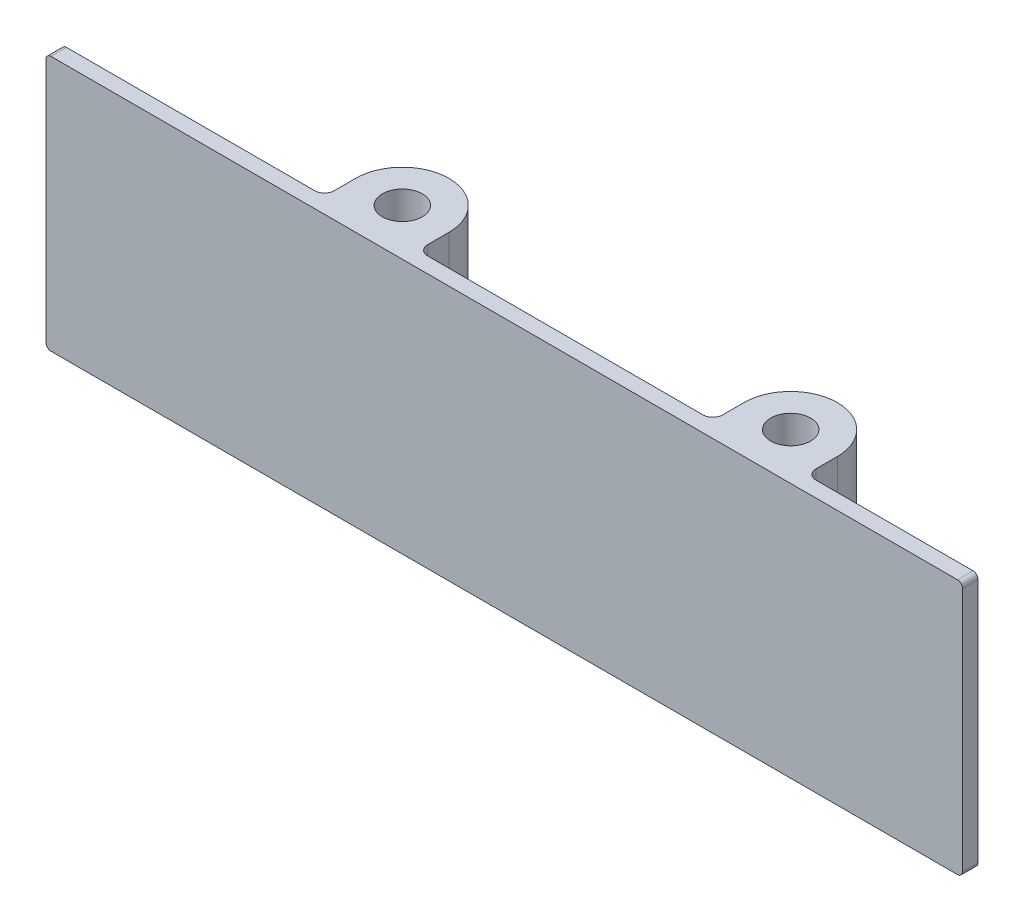
ISO-10303-21;
HEADER;
FILE_DESCRIPTION(('STEP AP214'),'2;1');
FILE_NAME('part.step','',(''),(''),'','','');
FILE_SCHEMA(('AUTOMOTIVE_DESIGN { 1 0 10303 214 1 1 1 1 }'));
ENDSEC;
DATA;
#1=APPLICATION_CONTEXT('core data for automotive mechanical design processes');
#2=APPLICATION_PROTOCOL_DEFINITION('international standard','automotive_design',2000,#1);
#3=PRODUCT_CONTEXT('',#1,'mechanical');
#4=PRODUCT('Part','Part','',(#3));
#5=PRODUCT_RELATED_PRODUCT_CATEGORY('part','',(#4));
#6=PRODUCT_DEFINITION_FORMATION('','',#4);
#7=PRODUCT_DEFINITION_CONTEXT('part definition',#1,'design');
#8=PRODUCT_DEFINITION('design','',#6,#7);
#9=PRODUCT_DEFINITION_SHAPE('','',#8);
#10=(LENGTH_UNIT() NAMED_UNIT(*) SI_UNIT(.MILLI.,.METRE.));
#11=(NAMED_UNIT(*) PLANE_ANGLE_UNIT() SI_UNIT($,.RADIAN.));
#12=(NAMED_UNIT(*) SI_UNIT($,.STERADIAN.) SOLID_ANGLE_UNIT());
#13=UNCERTAINTY_MEASURE_WITH_UNIT(LENGTH_MEASURE(1.E-05),#10,'distance_accuracy_value','');
#14=(GEOMETRIC_REPRESENTATION_CONTEXT(3) GLOBAL_UNCERTAINTY_ASSIGNED_CONTEXT((#13)) GLOBAL_UNIT_ASSIGNED_CONTEXT((#10,
#11,#12)) REPRESENTATION_CONTEXT('',''));
#15=CARTESIAN_POINT('',(0.,0.,0.));
#16=DIRECTION('',(0.,0.,1.));
#17=DIRECTION('',(1.,0.,0.));
#18=AXIS2_PLACEMENT_3D('',#15,#16,#17);
#19=CARTESIAN_POINT('',(0.,0.,0.));
#20=DIRECTION('',(0.,0.,-1.));
#21=DIRECTION('',(-1.,0.,0.));
#22=AXIS2_PLACEMENT_3D('',#19,#20,#21);
#23=PLANE('',#22);
#24=DIRECTION('',(0.,1.,0.));
#25=VECTOR('',#24,1.);
#26=CARTESIAN_POINT('',(187.00242,0.,0.));
#27=LINE('',#26,#25);
#28=CARTESIAN_POINT('',(187.00242,1.,0.));
#29=VERTEX_POINT('',#28);
#30=CARTESIAN_POINT('',(187.00242,51.10048,0.));
#31=VERTEX_POINT('',#30);
#32=EDGE_CURVE('E262',#29,#31,#27,.T.);
#33=ORIENTED_EDGE('',*,*,#32,.F.);
#34=CARTESIAN_POINT('',(186.00242,1.,0.));
#35=DIRECTION('',(0.,0.,-1.));
#36=DIRECTION('',(-1.,0.,0.));
#37=AXIS2_PLACEMENT_3D('',#34,#35,#36);
#38=CIRCLE('',#37,1.);
#39=CARTESIAN_POINT('',(186.00242,0.,0.));
#40=VERTEX_POINT('',#39);
#41=EDGE_CURVE('E310',#29,#40,#38,.T.);
#42=ORIENTED_EDGE('',*,*,#41,.T.);
#43=DIRECTION('',(1.,0.,0.));
#44=VECTOR('',#43,1.);
#45=CARTESIAN_POINT('',(0.,0.,0.));
#46=LINE('',#45,#44);
#47=CARTESIAN_POINT('',(153.95541999,0.,0.));
#48=VERTEX_POINT('',#47);
#49=EDGE_CURVE('E259',#48,#40,#46,.T.);
#50=ORIENTED_EDGE('',*,*,#49,.F.);
#51=DIRECTION('',(0.,1.,0.));
#52=VECTOR('',#51,1.);
#53=CARTESIAN_POINT('',(153.95541999,52.10048,0.));
#54=LINE('',#53,#52);
#55=CARTESIAN_POINT('',(153.95541999,52.10048,0.));
#56=VERTEX_POINT('',#55);
#57=EDGE_CURVE('E281',#48,#56,#54,.T.);
#58=ORIENTED_EDGE('',*,*,#57,.T.);
#59=DIRECTION('',(-1.,0.,0.));
#60=VECTOR('',#59,1.);
#61=CARTESIAN_POINT('',(0.,52.10048,0.));
#62=LINE('',#61,#60);
#63=CARTESIAN_POINT('',(186.00242,52.10048,0.));
#64=VERTEX_POINT('',#63);
#65=EDGE_CURVE('E248',#64,#56,#62,.T.);
#66=ORIENTED_EDGE('',*,*,#65,.F.);
#67=CARTESIAN_POINT('',(186.00242,51.10048,0.));
#68=DIRECTION('',(0.,0.,-1.));
#69=DIRECTION('',(-1.,0.,0.));
#70=AXIS2_PLACEMENT_3D('',#67,#68,#69);
#71=CIRCLE('',#70,1.);
#72=EDGE_CURVE('E308',#64,#31,#71,.T.);
#73=ORIENTED_EDGE('',*,*,#72,.T.);
#74=EDGE_LOOP('',(#33,#42,#50,#58,#66,#73));
#75=FACE_BOUND('',#74,.T.);
#76=ADVANCED_FACE('F36',(#75),#23,.T.);
#77=CARTESIAN_POINT('',(130.89542001,52.10048,0.));
#78=VERTEX_POINT('',#77);
#79=CARTESIAN_POINT('',(74.70741999,52.10048,0.));
#80=VERTEX_POINT('',#79);
#81=EDGE_CURVE('E268',#78,#80,#62,.T.);
#82=ORIENTED_EDGE('',*,*,#81,.F.);
#83=DIRECTION('',(0.,1.,0.));
#84=VECTOR('',#83,1.);
#85=CARTESIAN_POINT('',(130.89542001,0.,0.));
#86=LINE('',#85,#84);
#87=CARTESIAN_POINT('',(130.89542001,0.,0.));
#88=VERTEX_POINT('',#87);
#89=EDGE_CURVE('E279',#78,#88,#86,.F.);
#90=ORIENTED_EDGE('',*,*,#89,.T.);
#91=CARTESIAN_POINT('',(74.70741999,0.,0.));
#92=VERTEX_POINT('',#91);
#93=EDGE_CURVE('E263',#92,#88,#46,.T.);
#94=ORIENTED_EDGE('',*,*,#93,.F.);
#95=DIRECTION('',(0.,1.,0.));
#96=VECTOR('',#95,1.);
#97=CARTESIAN_POINT('',(74.70741999,52.10048,0.));
#98=LINE('',#97,#96);
#99=EDGE_CURVE('E276',#92,#80,#98,.T.);
#100=ORIENTED_EDGE('',*,*,#99,.T.);
#101=EDGE_LOOP('',(#82,#90,#94,#100));
#102=FACE_BOUND('',#101,.T.);
#103=ADVANCED_FACE('F396',(#102),#23,.T.);
#104=CARTESIAN_POINT('',(0.,0.,3.175));
#105=DIRECTION('',(1.,0.,0.));
#106=DIRECTION('',(0.,0.,-1.));
#107=AXIS2_PLACEMENT_3D('',#104,#105,#106);
#108=PLANE('',#107);
#109=DIRECTION('',(0.,-1.,0.));
#110=VECTOR('',#109,1.);
#111=CARTESIAN_POINT('',(0.,0.,0.));
#112=LINE('',#111,#110);
#113=CARTESIAN_POINT('',(0.,51.10048,0.));
#114=VERTEX_POINT('',#113);
#115=CARTESIAN_POINT('',(0.,1.,0.));
#116=VERTEX_POINT('',#115);
#117=EDGE_CURVE('E242',#114,#116,#112,.T.);
#118=ORIENTED_EDGE('',*,*,#117,.T.);
#119=DIRECTION('',(0.,0.,-1.));
#120=VECTOR('',#119,1.);
#121=CARTESIAN_POINT('',(0.,1.,3.175));
#122=LINE('',#121,#120);
#123=CARTESIAN_POINT('',(0.,1.,3.175));
#124=VERTEX_POINT('',#123);
#125=EDGE_CURVE('E11',#116,#124,#122,.F.);
#126=ORIENTED_EDGE('',*,*,#125,.T.);
#127=DIRECTION('',(0.,-1.,0.));
#128=VECTOR('',#127,1.);
#129=CARTESIAN_POINT('',(0.,0.,3.175));
#130=LINE('',#129,#128);
#131=CARTESIAN_POINT('',(0.,51.10048,3.175));
#132=VERTEX_POINT('',#131);
#133=EDGE_CURVE('E244',#132,#124,#130,.T.);
#134=ORIENTED_EDGE('',*,*,#133,.F.);
#135=DIRECTION('',(0.,0.,-1.));
#136=VECTOR('',#135,1.);
#137=CARTESIAN_POINT('',(0.,51.10048,3.175));
#138=LINE('',#137,#136);
#139=EDGE_CURVE('E44',#132,#114,#138,.T.);
#140=ORIENTED_EDGE('',*,*,#139,.T.);
#141=EDGE_LOOP('',(#118,#126,#134,#140));
#142=FACE_BOUND('',#141,.T.);
#143=ADVANCED_FACE('F333',(#142),#108,.F.);
#144=CARTESIAN_POINT('',(0.,0.,3.175));
#145=DIRECTION('',(0.,1.,0.));
#146=DIRECTION('',(0.,0.,1.));
#147=AXIS2_PLACEMENT_3D('',#144,#145,#146);
#148=PLANE('',#147);
#149=ORIENTED_EDGE('',*,*,#49,.T.);
#150=DIRECTION('',(0.,0.,-1.));
#151=VECTOR('',#150,1.);
#152=CARTESIAN_POINT('',(186.00242,0.,3.175));
#153=LINE('',#152,#151);
#154=CARTESIAN_POINT('',(186.00242,0.,3.175));
#155=VERTEX_POINT('',#154);
#156=EDGE_CURVE('E315',#40,#155,#153,.F.);
#157=ORIENTED_EDGE('',*,*,#156,.T.);
#158=DIRECTION('',(1.,0.,0.));
#159=VECTOR('',#158,1.);
#160=CARTESIAN_POINT('',(0.,0.,3.175));
#161=LINE('',#160,#159);
#162=CARTESIAN_POINT('',(1.,0.,3.175));
#163=VERTEX_POINT('',#162);
#164=EDGE_CURVE('E247',#163,#155,#161,.T.);
#165=ORIENTED_EDGE('',*,*,#164,.F.);
#166=DIRECTION('',(0.,0.,-1.));
#167=VECTOR('',#166,1.);
#168=CARTESIAN_POINT('',(1.,0.,3.175));
#169=LINE('',#168,#167);
#170=CARTESIAN_POINT('',(1.,0.,0.));
#171=VERTEX_POINT('',#170);
#172=EDGE_CURVE('E312',#163,#171,#169,.T.);
#173=ORIENTED_EDGE('',*,*,#172,.T.);
#174=CARTESIAN_POINT('',(51.64742001,0.,0.));
#175=VERTEX_POINT('',#174);
#176=EDGE_CURVE('E260',#171,#175,#46,.T.);
#177=ORIENTED_EDGE('',*,*,#176,.T.);
#178=CARTESIAN_POINT('',(51.64742001,0.,-2.));
#179=DIRECTION('',(0.,1.,0.));
#180=DIRECTION('',(0.,0.,1.));
#181=AXIS2_PLACEMENT_3D('',#178,#179,#180);
#182=CIRCLE('',#181,2.);
#183=CARTESIAN_POINT('',(53.64742001,0.,-2.00000000000001));
#184=VERTEX_POINT('',#183);
#185=EDGE_CURVE('E290',#175,#184,#182,.T.);
#186=ORIENTED_EDGE('',*,*,#185,.T.);
#187=DIRECTION('',(0.,0.,1.));
#188=VECTOR('',#187,1.);
#189=CARTESIAN_POINT('',(53.64742001,0.,-6.35499999));
#190=LINE('',#189,#188);
#191=CARTESIAN_POINT('',(53.64742001,0.,-6.35499999));
#192=VERTEX_POINT('',#191);
#193=EDGE_CURVE('E226',#192,#184,#190,.T.);
#194=ORIENTED_EDGE('',*,*,#193,.F.);
#195=CARTESIAN_POINT('',(63.17742,0.,-6.35499999));
#196=DIRECTION('',(0.,1.,0.));
#197=DIRECTION('',(0.,0.,1.));
#198=AXIS2_PLACEMENT_3D('',#195,#196,#197);
#199=CIRCLE('',#198,9.52999999);
#200=CARTESIAN_POINT('',(72.70741999,0.,-6.35499999));
#201=VERTEX_POINT('',#200);
#202=EDGE_CURVE('E223',#201,#192,#199,.T.);
#203=ORIENTED_EDGE('',*,*,#202,.F.);
#204=DIRECTION('',(0.,0.,-1.));
#205=VECTOR('',#204,1.);
#206=CARTESIAN_POINT('',(72.70741999,0.,-6.35499999));
#207=LINE('',#206,#205);
#208=CARTESIAN_POINT('',(72.70741999,0.,-2.));
#209=VERTEX_POINT('',#208);
#210=EDGE_CURVE('E230',#209,#201,#207,.T.);
#211=ORIENTED_EDGE('',*,*,#210,.F.);
#212=CARTESIAN_POINT('',(74.70741999,0.,-2.));
#213=DIRECTION('',(0.,1.,0.));
#214=DIRECTION('',(0.,0.,1.));
#215=AXIS2_PLACEMENT_3D('',#212,#213,#214);
#216=CIRCLE('',#215,2.);
#217=EDGE_CURVE('E301',#209,#92,#216,.T.);
#218=ORIENTED_EDGE('',*,*,#217,.T.);
#219=ORIENTED_EDGE('',*,*,#93,.T.);
#220=CARTESIAN_POINT('',(130.89542001,0.,-2.));
#221=DIRECTION('',(0.,1.,0.));
#222=DIRECTION('',(0.,0.,1.));
#223=AXIS2_PLACEMENT_3D('',#220,#221,#222);
#224=CIRCLE('',#223,2.);
#225=CARTESIAN_POINT('',(132.89542001,0.,-2.));
#226=VERTEX_POINT('',#225);
#227=EDGE_CURVE('E198',#88,#226,#224,.T.);
#228=ORIENTED_EDGE('',*,*,#227,.T.);
#229=DIRECTION('',(0.,0.,1.));
#230=VECTOR('',#229,1.);
#231=CARTESIAN_POINT('',(132.89542001,0.,-6.35499999000002));
#232=LINE('',#231,#230);
#233=CARTESIAN_POINT('',(132.89542001,0.,-6.35499999000002));
#234=VERTEX_POINT('',#233);
#235=EDGE_CURVE('E178',#234,#226,#232,.T.);
#236=ORIENTED_EDGE('',*,*,#235,.F.);
#237=CARTESIAN_POINT('',(142.42542,0.,-6.35499999000002));
#238=DIRECTION('',(0.,1.,0.));
#239=DIRECTION('',(0.,0.,1.));
#240=AXIS2_PLACEMENT_3D('',#237,#238,#239);
#241=CIRCLE('',#240,9.52999999000001);
#242=CARTESIAN_POINT('',(151.95541999,0.,-6.35499999000002));
#243=VERTEX_POINT('',#242);
#244=EDGE_CURVE('E195',#243,#234,#241,.T.);
#245=ORIENTED_EDGE('',*,*,#244,.F.);
#246=DIRECTION('',(0.,0.,-1.));
#247=VECTOR('',#246,1.);
#248=CARTESIAN_POINT('',(151.95541999,0.,-6.35499999000002));
#249=LINE('',#248,#247);
#250=CARTESIAN_POINT('',(151.95541999,0.,-2.));
#251=VERTEX_POINT('',#250);
#252=EDGE_CURVE('E187',#251,#243,#249,.T.);
#253=ORIENTED_EDGE('',*,*,#252,.F.);
#254=CARTESIAN_POINT('',(153.95541999,0.,-2.));
#255=DIRECTION('',(0.,1.,0.));
#256=DIRECTION('',(0.,0.,1.));
#257=AXIS2_PLACEMENT_3D('',#254,#255,#256);
#258=CIRCLE('',#257,2.);
#259=EDGE_CURVE('E297',#251,#48,#258,.T.);
#260=ORIENTED_EDGE('',*,*,#259,.T.);
#261=EDGE_LOOP('',(#149,#157,#165,#173,#177,#186,#194,#203,#211,#218,#219,#228,#236,#245,#253,#260));
#262=FACE_BOUND('',#261,.T.);
#263=CARTESIAN_POINT('',(63.17742,0.,-6.35499999));
#264=DIRECTION('',(0.,1.,0.));
#265=DIRECTION('',(0.,0.,1.));
#266=AXIS2_PLACEMENT_3D('',#263,#264,#265);
#267=CIRCLE('',#266,4.07499997799999);
#268=CARTESIAN_POINT('',(63.17742,0.,-2.28000001200001));
#269=VERTEX_POINT('',#268);
#270=EDGE_CURVE('E217',#269,#269,#267,.T.);
#271=ORIENTED_EDGE('',*,*,#270,.T.);
#272=EDGE_LOOP('',(#271));
#273=FACE_BOUND('',#272,.T.);
#274=CARTESIAN_POINT('',(142.42542,0.,-6.35499999000002));
#275=DIRECTION('',(0.,1.,0.));
#276=DIRECTION('',(0.,0.,1.));
#277=AXIS2_PLACEMENT_3D('',#274,#275,#276);
#278=CIRCLE('',#277,4.07499997800001);
#279=CARTESIAN_POINT('',(142.42542,0.,-2.28000001200001));
#280=VERTEX_POINT('',#279);
#281=EDGE_CURVE('E213',#280,#280,#278,.T.);
#282=ORIENTED_EDGE('',*,*,#281,.T.);
#283=EDGE_LOOP('',(#282));
#284=FACE_BOUND('',#283,.T.);
#285=ADVANCED_FACE('F192',(#262,#273,#284),#148,.F.);
#286=CARTESIAN_POINT('',(187.00242,0.,3.175));
#287=DIRECTION('',(-1.,0.,0.));
#288=DIRECTION('',(0.,0.,1.));
#289=AXIS2_PLACEMENT_3D('',#286,#287,#288);
#290=PLANE('',#289);
#291=DIRECTION('',(0.,1.,0.));
#292=VECTOR('',#291,1.);
#293=CARTESIAN_POINT('',(187.00242,0.,3.175));
#294=LINE('',#293,#292);
#295=CARTESIAN_POINT('',(187.00242,1.,3.175));
#296=VERTEX_POINT('',#295);
#297=CARTESIAN_POINT('',(187.00242,51.10048,3.175));
#298=VERTEX_POINT('',#297);
#299=EDGE_CURVE('E251',#296,#298,#294,.T.);
#300=ORIENTED_EDGE('',*,*,#299,.F.);
#301=DIRECTION('',(0.,0.,-1.));
#302=VECTOR('',#301,1.);
#303=CARTESIAN_POINT('',(187.00242,1.,3.175));
#304=LINE('',#303,#302);
#305=EDGE_CURVE('E305',#296,#29,#304,.T.);
#306=ORIENTED_EDGE('',*,*,#305,.T.);
#307=ORIENTED_EDGE('',*,*,#32,.T.);
#308=DIRECTION('',(0.,0.,-1.));
#309=VECTOR('',#308,1.);
#310=CARTESIAN_POINT('',(187.00242,51.10048,3.175));
#311=LINE('',#310,#309);
#312=EDGE_CURVE('E303',#31,#298,#311,.F.);
#313=ORIENTED_EDGE('',*,*,#312,.T.);
#314=EDGE_LOOP('',(#300,#306,#307,#313));
#315=FACE_BOUND('',#314,.T.);
#316=ADVANCED_FACE('F357',(#315),#290,.F.);
#317=CARTESIAN_POINT('',(0.,52.10048,3.175));
#318=DIRECTION('',(0.,-1.,0.));
#319=DIRECTION('',(0.,0.,-1.));
#320=AXIS2_PLACEMENT_3D('',#317,#318,#319);
#321=PLANE('',#320);
#322=DIRECTION('',(-1.,0.,0.));
#323=VECTOR('',#322,1.);
#324=CARTESIAN_POINT('',(0.,52.10048,3.175));
#325=LINE('',#324,#323);
#326=CARTESIAN_POINT('',(186.00242,52.10048,3.175));
#327=VERTEX_POINT('',#326);
#328=CARTESIAN_POINT('',(1.,52.10048,3.175));
#329=VERTEX_POINT('',#328);
#330=EDGE_CURVE('E254',#327,#329,#325,.T.);
#331=ORIENTED_EDGE('',*,*,#330,.F.);
#332=DIRECTION('',(0.,0.,-1.));
#333=VECTOR('',#332,1.);
#334=CARTESIAN_POINT('',(186.00242,52.10048,3.175));
#335=LINE('',#334,#333);
#336=EDGE_CURVE('E327',#327,#64,#335,.T.);
#337=ORIENTED_EDGE('',*,*,#336,.T.);
#338=ORIENTED_EDGE('',*,*,#65,.T.);
#339=CARTESIAN_POINT('',(153.95541999,52.10048,-2.));
#340=DIRECTION('',(0.,-1.,0.));
#341=DIRECTION('',(0.,0.,-1.));
#342=AXIS2_PLACEMENT_3D('',#339,#340,#341);
#343=CIRCLE('',#342,2.);
#344=CARTESIAN_POINT('',(151.95541999,52.10048,-2.));
#345=VERTEX_POINT('',#344);
#346=EDGE_CURVE('E295',#56,#345,#343,.T.);
#347=ORIENTED_EDGE('',*,*,#346,.T.);
#348=DIRECTION('',(0.,0.,-1.));
#349=VECTOR('',#348,1.);
#350=CARTESIAN_POINT('',(151.95541999,52.10048,-6.35499999000002));
#351=LINE('',#350,#349);
#352=CARTESIAN_POINT('',(151.95541999,52.10048,-6.35499999000002));
#353=VERTEX_POINT('',#352);
#354=EDGE_CURVE('E203',#345,#353,#351,.T.);
#355=ORIENTED_EDGE('',*,*,#354,.T.);
#356=CARTESIAN_POINT('',(142.42542,52.10048,-6.35499999000002));
#357=DIRECTION('',(0.,1.,0.));
#358=DIRECTION('',(0.,0.,1.));
#359=AXIS2_PLACEMENT_3D('',#356,#357,#358);
#360=CIRCLE('',#359,9.52999999000001);
#361=CARTESIAN_POINT('',(132.89542001,52.10048,-6.35499999000002));
#362=VERTEX_POINT('',#361);
#363=EDGE_CURVE('E211',#353,#362,#360,.T.);
#364=ORIENTED_EDGE('',*,*,#363,.T.);
#365=DIRECTION('',(0.,0.,1.));
#366=VECTOR('',#365,1.);
#367=CARTESIAN_POINT('',(132.89542001,52.10048,-6.35499999000002));
#368=LINE('',#367,#366);
#369=CARTESIAN_POINT('',(132.89542001,52.10048,-2.));
#370=VERTEX_POINT('',#369);
#371=EDGE_CURVE('E181',#362,#370,#368,.T.);
#372=ORIENTED_EDGE('',*,*,#371,.T.);
#373=CARTESIAN_POINT('',(130.89542001,52.10048,-2.));
#374=DIRECTION('',(0.,-1.,0.));
#375=DIRECTION('',(0.,0.,-1.));
#376=AXIS2_PLACEMENT_3D('',#373,#374,#375);
#377=CIRCLE('',#376,2.);
#378=EDGE_CURVE('E292',#370,#78,#377,.T.);
#379=ORIENTED_EDGE('',*,*,#378,.T.);
#380=ORIENTED_EDGE('',*,*,#81,.T.);
#381=CARTESIAN_POINT('',(74.70741999,52.10048,-2.));
#382=DIRECTION('',(0.,-1.,0.));
#383=DIRECTION('',(0.,0.,-1.));
#384=AXIS2_PLACEMENT_3D('',#381,#382,#383);
#385=CIRCLE('',#384,2.);
#386=CARTESIAN_POINT('',(72.70741999,52.10048,-2.));
#387=VERTEX_POINT('',#386);
#388=EDGE_CURVE('E299',#80,#387,#385,.T.);
#389=ORIENTED_EDGE('',*,*,#388,.T.);
#390=DIRECTION('',(0.,0.,-1.));
#391=VECTOR('',#390,1.);
#392=CARTESIAN_POINT('',(72.70741999,52.10048,-6.35499999));
#393=LINE('',#392,#391);
#394=CARTESIAN_POINT('',(72.70741999,52.10048,-6.35499999));
#395=VERTEX_POINT('',#394);
#396=EDGE_CURVE('E227',#387,#395,#393,.T.);
#397=ORIENTED_EDGE('',*,*,#396,.T.);
#398=CARTESIAN_POINT('',(63.17742,52.10048,-6.35499999));
#399=DIRECTION('',(0.,1.,0.));
#400=DIRECTION('',(0.,0.,1.));
#401=AXIS2_PLACEMENT_3D('',#398,#399,#400);
#402=CIRCLE('',#401,9.52999999);
#403=CARTESIAN_POINT('',(53.64742001,52.10048,-6.35499999));
#404=VERTEX_POINT('',#403);
#405=EDGE_CURVE('E220',#395,#404,#402,.T.);
#406=ORIENTED_EDGE('',*,*,#405,.T.);
#407=DIRECTION('',(0.,0.,1.));
#408=VECTOR('',#407,1.);
#409=CARTESIAN_POINT('',(53.64742001,52.10048,-6.35499999));
#410=LINE('',#409,#408);
#411=CARTESIAN_POINT('',(53.64742001,52.10048,-2.00000000000001));
#412=VERTEX_POINT('',#411);
#413=EDGE_CURVE('E235',#404,#412,#410,.T.);
#414=ORIENTED_EDGE('',*,*,#413,.T.);
#415=CARTESIAN_POINT('',(51.64742001,52.10048,-2.));
#416=DIRECTION('',(0.,-1.,0.));
#417=DIRECTION('',(0.,0.,-1.));
#418=AXIS2_PLACEMENT_3D('',#415,#416,#417);
#419=CIRCLE('',#418,2.);
#420=CARTESIAN_POINT('',(51.64742001,52.10048,0.));
#421=VERTEX_POINT('',#420);
#422=EDGE_CURVE('E288',#412,#421,#419,.T.);
#423=ORIENTED_EDGE('',*,*,#422,.T.);
#424=CARTESIAN_POINT('',(1.,52.10048,0.));
#425=VERTEX_POINT('',#424);
#426=EDGE_CURVE('E266',#421,#425,#62,.T.);
#427=ORIENTED_EDGE('',*,*,#426,.T.);
#428=DIRECTION('',(0.,0.,-1.));
#429=VECTOR('',#428,1.);
#430=CARTESIAN_POINT('',(1.,52.10048,3.175));
#431=LINE('',#430,#429);
#432=EDGE_CURVE('E325',#425,#329,#431,.F.);
#433=ORIENTED_EDGE('',*,*,#432,.T.);
#434=EDGE_LOOP('',(#331,#337,#338,#347,#355,#364,#372,#379,#380,#389,#397,#406,#414,#423,#427,#433));
#435=FACE_BOUND('',#434,.T.);
#436=CARTESIAN_POINT('',(63.17742,52.10048,-6.35499999));
#437=DIRECTION('',(0.,1.,0.));
#438=DIRECTION('',(0.,0.,1.));
#439=AXIS2_PLACEMENT_3D('',#436,#437,#438);
#440=CIRCLE('',#439,4.07499997799999);
#441=CARTESIAN_POINT('',(63.17742,52.10048,-2.28000001200001));
#442=VERTEX_POINT('',#441);
#443=EDGE_CURVE('E215',#442,#442,#440,.T.);
#444=ORIENTED_EDGE('',*,*,#443,.F.);
#445=EDGE_LOOP('',(#444));
#446=FACE_BOUND('',#445,.T.);
#447=CARTESIAN_POINT('',(142.42542,52.10048,-6.35499999000002));
#448=DIRECTION('',(0.,1.,0.));
#449=DIRECTION('',(0.,0.,1.));
#450=AXIS2_PLACEMENT_3D('',#447,#448,#449);
#451=CIRCLE('',#450,4.07499997800001);
#452=CARTESIAN_POINT('',(142.42542,52.10048,-2.28000001200001));
#453=VERTEX_POINT('',#452);
#454=EDGE_CURVE('E207',#453,#453,#451,.T.);
#455=ORIENTED_EDGE('',*,*,#454,.F.);
#456=EDGE_LOOP('',(#455));
#457=FACE_BOUND('',#456,.T.);
#458=ADVANCED_FACE('F342',(#435,#446,#457),#321,.F.);
#459=CARTESIAN_POINT('',(0.,0.,3.175));
#460=DIRECTION('',(0.,0.,-1.));
#461=DIRECTION('',(-1.,0.,0.));
#462=AXIS2_PLACEMENT_3D('',#459,#460,#461);
#463=PLANE('',#462);
#464=ORIENTED_EDGE('',*,*,#164,.T.);
#465=CARTESIAN_POINT('',(186.00242,1.,3.175));
#466=DIRECTION('',(0.,0.,-1.));
#467=DIRECTION('',(-1.,0.,0.));
#468=AXIS2_PLACEMENT_3D('',#465,#466,#467);
#469=CIRCLE('',#468,1.);
#470=EDGE_CURVE('E323',#155,#296,#469,.F.);
#471=ORIENTED_EDGE('',*,*,#470,.T.);
#472=ORIENTED_EDGE('',*,*,#299,.T.);
#473=CARTESIAN_POINT('',(186.00242,51.10048,3.175));
#474=DIRECTION('',(0.,0.,-1.));
#475=DIRECTION('',(-1.,0.,0.));
#476=AXIS2_PLACEMENT_3D('',#473,#474,#475);
#477=CIRCLE('',#476,1.);
#478=EDGE_CURVE('E321',#298,#327,#477,.F.);
#479=ORIENTED_EDGE('',*,*,#478,.T.);
#480=ORIENTED_EDGE('',*,*,#330,.T.);
#481=CARTESIAN_POINT('',(1.,51.10048,3.175));
#482=DIRECTION('',(0.,0.,-1.));
#483=DIRECTION('',(-1.,0.,0.));
#484=AXIS2_PLACEMENT_3D('',#481,#482,#483);
#485=CIRCLE('',#484,1.);
#486=EDGE_CURVE('E317',#329,#132,#485,.F.);
#487=ORIENTED_EDGE('',*,*,#486,.T.);
#488=ORIENTED_EDGE('',*,*,#133,.T.);
#489=CARTESIAN_POINT('',(1.,1.,3.175));
#490=DIRECTION('',(0.,0.,-1.));
#491=DIRECTION('',(-1.,0.,0.));
#492=AXIS2_PLACEMENT_3D('',#489,#490,#491);
#493=CIRCLE('',#492,1.);
#494=EDGE_CURVE('E319',#124,#163,#493,.F.);
#495=ORIENTED_EDGE('',*,*,#494,.T.);
#496=EDGE_LOOP('',(#464,#471,#472,#479,#480,#487,#488,#495));
#497=FACE_BOUND('',#496,.T.);
#498=ADVANCED_FACE('F345',(#497),#463,.F.);
#499=ORIENTED_EDGE('',*,*,#176,.F.);
#500=CARTESIAN_POINT('',(1.,1.,0.));
#501=DIRECTION('',(0.,0.,-1.));
#502=DIRECTION('',(-1.,0.,0.));
#503=AXIS2_PLACEMENT_3D('',#500,#501,#502);
#504=CIRCLE('',#503,1.);
#505=EDGE_CURVE('E51',#171,#116,#504,.T.);
#506=ORIENTED_EDGE('',*,*,#505,.T.);
#507=ORIENTED_EDGE('',*,*,#117,.F.);
#508=CARTESIAN_POINT('',(1.,51.10048,0.));
#509=DIRECTION('',(0.,0.,-1.));
#510=DIRECTION('',(-1.,0.,0.));
#511=AXIS2_PLACEMENT_3D('',#508,#509,#510);
#512=CIRCLE('',#511,1.);
#513=EDGE_CURVE('E59',#114,#425,#512,.T.);
#514=ORIENTED_EDGE('',*,*,#513,.T.);
#515=ORIENTED_EDGE('',*,*,#426,.F.);
#516=DIRECTION('',(0.,1.,0.));
#517=VECTOR('',#516,1.);
#518=CARTESIAN_POINT('',(51.64742001,0.,0.));
#519=LINE('',#518,#517);
#520=EDGE_CURVE('E271',#421,#175,#519,.F.);
#521=ORIENTED_EDGE('',*,*,#520,.T.);
#522=EDGE_LOOP('',(#499,#506,#507,#514,#515,#521));
#523=FACE_BOUND('',#522,.T.);
#524=ADVANCED_FACE('F336',(#523),#23,.T.);
#525=CARTESIAN_POINT('',(63.17742,0.,-6.35499999));
#526=DIRECTION('',(0.,1.,0.));
#527=DIRECTION('',(0.,0.,1.));
#528=AXIS2_PLACEMENT_3D('',#525,#526,#527);
#529=CYLINDRICAL_SURFACE('',#528,9.52999999);
#530=ORIENTED_EDGE('',*,*,#405,.F.);
#531=DIRECTION('',(0.,1.,0.));
#532=VECTOR('',#531,1.);
#533=CARTESIAN_POINT('',(72.70741999,0.,-6.35499999));
#534=LINE('',#533,#532);
#535=EDGE_CURVE('E239',#201,#395,#534,.T.);
#536=ORIENTED_EDGE('',*,*,#535,.F.);
#537=ORIENTED_EDGE('',*,*,#202,.T.);
#538=DIRECTION('',(0.,1.,0.));
#539=VECTOR('',#538,1.);
#540=CARTESIAN_POINT('',(53.64742001,0.,-6.35499999));
#541=LINE('',#540,#539);
#542=EDGE_CURVE('E232',#192,#404,#541,.T.);
#543=ORIENTED_EDGE('',*,*,#542,.T.);
#544=EDGE_LOOP('',(#530,#536,#537,#543));
#545=FACE_BOUND('',#544,.T.);
#546=ADVANCED_FACE('F404',(#545),#529,.T.);
#547=CARTESIAN_POINT('',(72.70741999,0.,-6.35499999));
#548=DIRECTION('',(1.,0.,0.));
#549=DIRECTION('',(0.,0.,-1.));
#550=AXIS2_PLACEMENT_3D('',#547,#548,#549);
#551=PLANE('',#550);
#552=ORIENTED_EDGE('',*,*,#396,.F.);
#553=DIRECTION('',(0.,1.,0.));
#554=VECTOR('',#553,1.);
#555=CARTESIAN_POINT('',(72.70741999,0.,-2.));
#556=LINE('',#555,#554);
#557=EDGE_CURVE('E286',#387,#209,#556,.F.);
#558=ORIENTED_EDGE('',*,*,#557,.T.);
#559=ORIENTED_EDGE('',*,*,#210,.T.);
#560=ORIENTED_EDGE('',*,*,#535,.T.);
#561=EDGE_LOOP('',(#552,#558,#559,#560));
#562=FACE_BOUND('',#561,.T.);
#563=ADVANCED_FACE('F409',(#562),#551,.T.);
#564=CARTESIAN_POINT('',(53.64742001,0.,-6.35499999));
#565=DIRECTION('',(-1.,0.,0.));
#566=DIRECTION('',(0.,0.,1.));
#567=AXIS2_PLACEMENT_3D('',#564,#565,#566);
#568=PLANE('',#567);
#569=ORIENTED_EDGE('',*,*,#193,.T.);
#570=DIRECTION('',(0.,1.,0.));
#571=VECTOR('',#570,1.);
#572=CARTESIAN_POINT('',(53.64742001,52.10048,-2.00000000000001));
#573=LINE('',#572,#571);
#574=EDGE_CURVE('E257',#184,#412,#573,.T.);
#575=ORIENTED_EDGE('',*,*,#574,.T.);
#576=ORIENTED_EDGE('',*,*,#413,.F.);
#577=ORIENTED_EDGE('',*,*,#542,.F.);
#578=EDGE_LOOP('',(#569,#575,#576,#577));
#579=FACE_BOUND('',#578,.T.);
#580=ADVANCED_FACE('F416',(#579),#568,.T.);
#581=CARTESIAN_POINT('',(63.17742,0.,-6.35499999));
#582=DIRECTION('',(0.,1.,0.));
#583=DIRECTION('',(0.,0.,1.));
#584=AXIS2_PLACEMENT_3D('',#581,#582,#583);
#585=CYLINDRICAL_SURFACE('',#584,4.07499997799999);
#586=ORIENTED_EDGE('',*,*,#270,.F.);
#587=EDGE_LOOP('',(#586));
#588=FACE_BOUND('',#587,.T.);
#589=ORIENTED_EDGE('',*,*,#443,.T.);
#590=EDGE_LOOP('',(#589));
#591=FACE_BOUND('',#590,.T.);
#592=ADVANCED_FACE('F419',(#588,#591),#585,.F.);
#593=CARTESIAN_POINT('',(142.42542,0.,-6.35499999000002));
#594=DIRECTION('',(0.,1.,0.));
#595=DIRECTION('',(0.,0.,1.));
#596=AXIS2_PLACEMENT_3D('',#593,#594,#595);
#597=CYLINDRICAL_SURFACE('',#596,9.52999999000001);
#598=ORIENTED_EDGE('',*,*,#363,.F.);
#599=DIRECTION('',(0.,1.,0.));
#600=VECTOR('',#599,1.);
#601=CARTESIAN_POINT('',(151.95541999,0.,-6.35499999000002));
#602=LINE('',#601,#600);
#603=EDGE_CURVE('E186',#243,#353,#602,.T.);
#604=ORIENTED_EDGE('',*,*,#603,.F.);
#605=ORIENTED_EDGE('',*,*,#244,.T.);
#606=DIRECTION('',(0.,1.,0.));
#607=VECTOR('',#606,1.);
#608=CARTESIAN_POINT('',(132.89542001,0.,-6.35499999000002));
#609=LINE('',#608,#607);
#610=EDGE_CURVE('E174',#234,#362,#609,.T.);
#611=ORIENTED_EDGE('',*,*,#610,.T.);
#612=EDGE_LOOP('',(#598,#604,#605,#611));
#613=FACE_BOUND('',#612,.T.);
#614=ADVANCED_FACE('F201',(#613),#597,.T.);
#615=CARTESIAN_POINT('',(151.95541999,0.,-6.35499999000002));
#616=DIRECTION('',(1.,0.,0.));
#617=DIRECTION('',(0.,0.,-1.));
#618=AXIS2_PLACEMENT_3D('',#615,#616,#617);
#619=PLANE('',#618);
#620=ORIENTED_EDGE('',*,*,#354,.F.);
#621=DIRECTION('',(0.,1.,0.));
#622=VECTOR('',#621,1.);
#623=CARTESIAN_POINT('',(151.95541999,0.,-2.));
#624=LINE('',#623,#622);
#625=EDGE_CURVE('E284',#345,#251,#624,.F.);
#626=ORIENTED_EDGE('',*,*,#625,.T.);
#627=ORIENTED_EDGE('',*,*,#252,.T.);
#628=ORIENTED_EDGE('',*,*,#603,.T.);
#629=EDGE_LOOP('',(#620,#626,#627,#628));
#630=FACE_BOUND('',#629,.T.);
#631=ADVANCED_FACE('F381',(#630),#619,.T.);
#632=CARTESIAN_POINT('',(132.89542001,0.,-6.35499999000002));
#633=DIRECTION('',(-1.,0.,0.));
#634=DIRECTION('',(0.,0.,1.));
#635=AXIS2_PLACEMENT_3D('',#632,#633,#634);
#636=PLANE('',#635);
#637=ORIENTED_EDGE('',*,*,#235,.T.);
#638=DIRECTION('',(0.,1.,0.));
#639=VECTOR('',#638,1.);
#640=CARTESIAN_POINT('',(132.89542001,52.10048,-2.));
#641=LINE('',#640,#639);
#642=EDGE_CURVE('E274',#226,#370,#641,.T.);
#643=ORIENTED_EDGE('',*,*,#642,.T.);
#644=ORIENTED_EDGE('',*,*,#371,.F.);
#645=ORIENTED_EDGE('',*,*,#610,.F.);
#646=EDGE_LOOP('',(#637,#643,#644,#645));
#647=FACE_BOUND('',#646,.T.);
#648=ADVANCED_FACE('F176',(#647),#636,.T.);
#649=CARTESIAN_POINT('',(142.42542,0.,-6.35499999000002));
#650=DIRECTION('',(0.,1.,0.));
#651=DIRECTION('',(0.,0.,1.));
#652=AXIS2_PLACEMENT_3D('',#649,#650,#651);
#653=CYLINDRICAL_SURFACE('',#652,4.07499997800001);
#654=ORIENTED_EDGE('',*,*,#281,.F.);
#655=EDGE_LOOP('',(#654));
#656=FACE_BOUND('',#655,.T.);
#657=ORIENTED_EDGE('',*,*,#454,.T.);
#658=EDGE_LOOP('',(#657));
#659=FACE_BOUND('',#658,.T.);
#660=ADVANCED_FACE('F431',(#656,#659),#653,.F.);
#661=CARTESIAN_POINT('',(51.64742001,0.,-2.));
#662=DIRECTION('',(0.,-1.,0.));
#663=DIRECTION('',(0.,0.,-1.));
#664=AXIS2_PLACEMENT_3D('',#661,#662,#663);
#665=CYLINDRICAL_SURFACE('',#664,2.);
#666=ORIENTED_EDGE('',*,*,#185,.F.);
#667=ORIENTED_EDGE('',*,*,#520,.F.);
#668=ORIENTED_EDGE('',*,*,#422,.F.);
#669=ORIENTED_EDGE('',*,*,#574,.F.);
#670=EDGE_LOOP('',(#666,#667,#668,#669));
#671=FACE_BOUND('',#670,.T.);
#672=ADVANCED_FACE('F393',(#671),#665,.F.);
#673=CARTESIAN_POINT('',(130.89542001,0.,-2.));
#674=DIRECTION('',(0.,-1.,0.));
#675=DIRECTION('',(0.,0.,-1.));
#676=AXIS2_PLACEMENT_3D('',#673,#674,#675);
#677=CYLINDRICAL_SURFACE('',#676,2.);
#678=ORIENTED_EDGE('',*,*,#227,.F.);
#679=ORIENTED_EDGE('',*,*,#89,.F.);
#680=ORIENTED_EDGE('',*,*,#378,.F.);
#681=ORIENTED_EDGE('',*,*,#642,.F.);
#682=EDGE_LOOP('',(#678,#679,#680,#681));
#683=FACE_BOUND('',#682,.T.);
#684=ADVANCED_FACE('F374',(#683),#677,.F.);
#685=CARTESIAN_POINT('',(153.95541999,0.,-2.));
#686=DIRECTION('',(0.,-1.,0.));
#687=DIRECTION('',(0.,0.,-1.));
#688=AXIS2_PLACEMENT_3D('',#685,#686,#687);
#689=CYLINDRICAL_SURFACE('',#688,2.);
#690=ORIENTED_EDGE('',*,*,#259,.F.);
#691=ORIENTED_EDGE('',*,*,#625,.F.);
#692=ORIENTED_EDGE('',*,*,#346,.F.);
#693=ORIENTED_EDGE('',*,*,#57,.F.);
#694=EDGE_LOOP('',(#690,#691,#692,#693));
#695=FACE_BOUND('',#694,.T.);
#696=ADVANCED_FACE('F383',(#695),#689,.F.);
#697=CARTESIAN_POINT('',(74.70741999,0.,-2.));
#698=DIRECTION('',(0.,-1.,0.));
#699=DIRECTION('',(0.,0.,-1.));
#700=AXIS2_PLACEMENT_3D('',#697,#698,#699);
#701=CYLINDRICAL_SURFACE('',#700,2.);
#702=ORIENTED_EDGE('',*,*,#217,.F.);
#703=ORIENTED_EDGE('',*,*,#557,.F.);
#704=ORIENTED_EDGE('',*,*,#388,.F.);
#705=ORIENTED_EDGE('',*,*,#99,.F.);
#706=EDGE_LOOP('',(#702,#703,#704,#705));
#707=FACE_BOUND('',#706,.T.);
#708=ADVANCED_FACE('F385',(#707),#701,.F.);
#709=CARTESIAN_POINT('',(186.00242,1.,3.175));
#710=DIRECTION('',(0.,0.,-1.));
#711=DIRECTION('',(-1.,0.,0.));
#712=AXIS2_PLACEMENT_3D('',#709,#710,#711);
#713=CYLINDRICAL_SURFACE('',#712,1.);
#714=ORIENTED_EDGE('',*,*,#470,.F.);
#715=ORIENTED_EDGE('',*,*,#156,.F.);
#716=ORIENTED_EDGE('',*,*,#41,.F.);
#717=ORIENTED_EDGE('',*,*,#305,.F.);
#718=EDGE_LOOP('',(#714,#715,#716,#717));
#719=FACE_BOUND('',#718,.T.);
#720=ADVANCED_FACE('F361',(#719),#713,.T.);
#721=CARTESIAN_POINT('',(186.00242,51.10048,3.175));
#722=DIRECTION('',(0.,0.,-1.));
#723=DIRECTION('',(-1.,0.,0.));
#724=AXIS2_PLACEMENT_3D('',#721,#722,#723);
#725=CYLINDRICAL_SURFACE('',#724,1.);
#726=ORIENTED_EDGE('',*,*,#478,.F.);
#727=ORIENTED_EDGE('',*,*,#312,.F.);
#728=ORIENTED_EDGE('',*,*,#72,.F.);
#729=ORIENTED_EDGE('',*,*,#336,.F.);
#730=EDGE_LOOP('',(#726,#727,#728,#729));
#731=FACE_BOUND('',#730,.T.);
#732=ADVANCED_FACE('F351',(#731),#725,.T.);
#733=CARTESIAN_POINT('',(1.,1.,3.175));
#734=DIRECTION('',(0.,0.,-1.));
#735=DIRECTION('',(-1.,0.,0.));
#736=AXIS2_PLACEMENT_3D('',#733,#734,#735);
#737=CYLINDRICAL_SURFACE('',#736,1.);
#738=ORIENTED_EDGE('',*,*,#494,.F.);
#739=ORIENTED_EDGE('',*,*,#125,.F.);
#740=ORIENTED_EDGE('',*,*,#505,.F.);
#741=ORIENTED_EDGE('',*,*,#172,.F.);
#742=EDGE_LOOP('',(#738,#739,#740,#741));
#743=FACE_BOUND('',#742,.T.);
#744=ADVANCED_FACE('F582',(#743),#737,.T.);
#745=CARTESIAN_POINT('',(1.,51.10048,3.175));
#746=DIRECTION('',(0.,0.,-1.));
#747=DIRECTION('',(-1.,0.,0.));
#748=AXIS2_PLACEMENT_3D('',#745,#746,#747);
#749=CYLINDRICAL_SURFACE('',#748,1.);
#750=ORIENTED_EDGE('',*,*,#486,.F.);
#751=ORIENTED_EDGE('',*,*,#432,.F.);
#752=ORIENTED_EDGE('',*,*,#513,.F.);
#753=ORIENTED_EDGE('',*,*,#139,.F.);
#754=EDGE_LOOP('',(#750,#751,#752,#753));
#755=FACE_BOUND('',#754,.T.);
#756=ADVANCED_FACE('F38',(#755),#749,.T.);
#757=CLOSED_SHELL('',(#76,#103,#143,#285,#316,#458,#498,#524,#546,#563,#580,#592,#614,#631,#648,
#660,#672,#684,#696,#708,#720,#732,#744,#756));
#758=MANIFOLD_SOLID_BREP('B2',#757);
#759=ADVANCED_BREP_SHAPE_REPRESENTATION('',(#18,#758),#14);
#760=SHAPE_DEFINITION_REPRESENTATION(#9,#759);
ENDSEC;
END-ISO-10303-21;
